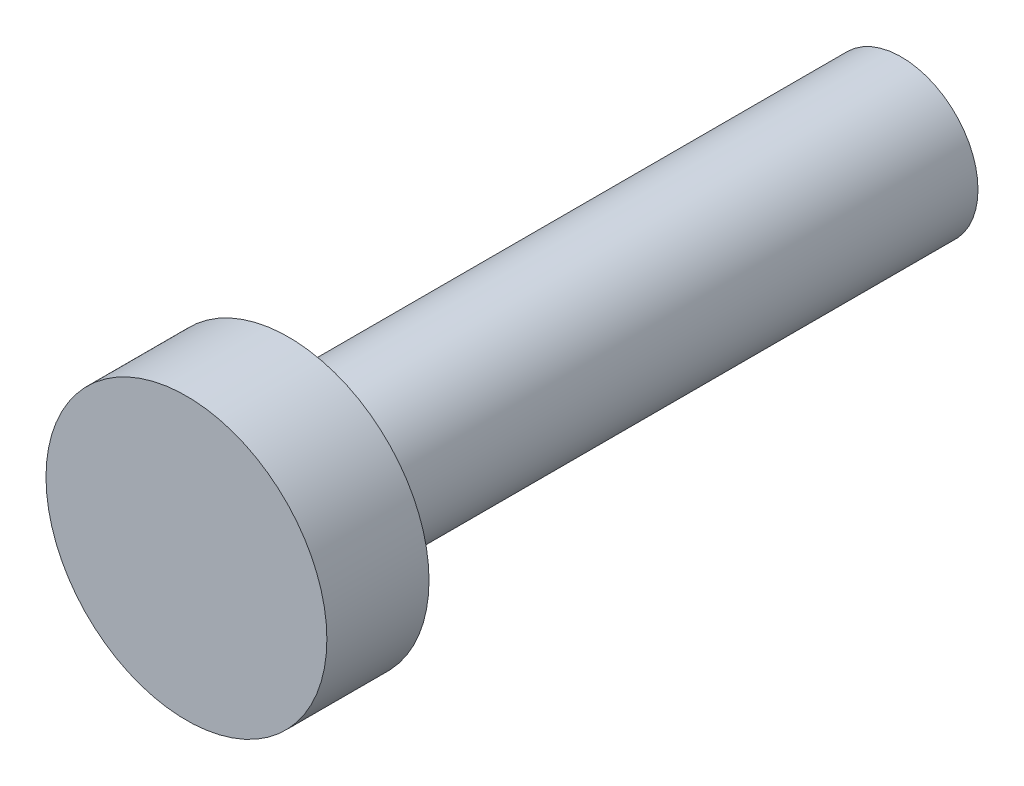
ISO-10303-21;
HEADER;
FILE_DESCRIPTION(('STEP AP214'),'2;1');
FILE_NAME('part.step','',(''),(''),'','','');
FILE_SCHEMA(('AUTOMOTIVE_DESIGN { 1 0 10303 214 1 1 1 1 }'));
ENDSEC;
DATA;
#1=APPLICATION_CONTEXT('core data for automotive mechanical design processes');
#2=APPLICATION_PROTOCOL_DEFINITION('international standard','automotive_design',2000,#1);
#3=PRODUCT_CONTEXT('',#1,'mechanical');
#4=PRODUCT('Part','Part','',(#3));
#5=PRODUCT_RELATED_PRODUCT_CATEGORY('part','',(#4));
#6=PRODUCT_DEFINITION_FORMATION('','',#4);
#7=PRODUCT_DEFINITION_CONTEXT('part definition',#1,'design');
#8=PRODUCT_DEFINITION('design','',#6,#7);
#9=PRODUCT_DEFINITION_SHAPE('','',#8);
#10=(LENGTH_UNIT() NAMED_UNIT(*) SI_UNIT(.MILLI.,.METRE.));
#11=(NAMED_UNIT(*) PLANE_ANGLE_UNIT() SI_UNIT($,.RADIAN.));
#12=(NAMED_UNIT(*) SI_UNIT($,.STERADIAN.) SOLID_ANGLE_UNIT());
#13=UNCERTAINTY_MEASURE_WITH_UNIT(LENGTH_MEASURE(1.E-05),#10,'distance_accuracy_value','');
#14=(GEOMETRIC_REPRESENTATION_CONTEXT(3) GLOBAL_UNCERTAINTY_ASSIGNED_CONTEXT((#13)) GLOBAL_UNIT_ASSIGNED_CONTEXT((#10,
#11,#12)) REPRESENTATION_CONTEXT('',''));
#15=CARTESIAN_POINT('',(0.,0.,0.));
#16=DIRECTION('',(0.,0.,1.));
#17=DIRECTION('',(1.,0.,0.));
#18=AXIS2_PLACEMENT_3D('',#15,#16,#17);
#19=CARTESIAN_POINT('',(0.,0.,0.));
#20=DIRECTION('',(0.,0.,-1.));
#21=DIRECTION('',(-1.,0.,0.));
#22=AXIS2_PLACEMENT_3D('',#19,#20,#21);
#23=CYLINDRICAL_SURFACE('',#22,1.5);
#24=CARTESIAN_POINT('',(0.,0.,0.));
#25=DIRECTION('',(0.,0.,1.));
#26=DIRECTION('',(1.,0.,0.));
#27=AXIS2_PLACEMENT_3D('',#24,#25,#26);
#28=CIRCLE('',#27,1.5);
#29=CARTESIAN_POINT('',(1.5,0.,0.));
#30=VERTEX_POINT('',#29);
#31=EDGE_CURVE('E10',#30,#30,#28,.T.);
#32=ORIENTED_EDGE('',*,*,#31,.F.);
#33=EDGE_LOOP('',(#32));
#34=FACE_BOUND('',#33,.T.);
#35=CARTESIAN_POINT('',(0.,0.,-12.));
#36=DIRECTION('',(0.,0.,1.));
#37=DIRECTION('',(1.,0.,0.));
#38=AXIS2_PLACEMENT_3D('',#35,#36,#37);
#39=CIRCLE('',#38,1.5);
#40=CARTESIAN_POINT('',(1.5,0.,-12.));
#41=VERTEX_POINT('',#40);
#42=EDGE_CURVE('E36',#41,#41,#39,.T.);
#43=ORIENTED_EDGE('',*,*,#42,.T.);
#44=EDGE_LOOP('',(#43));
#45=FACE_BOUND('',#44,.T.);
#46=ADVANCED_FACE('F33',(#34,#45),#23,.T.);
#47=CARTESIAN_POINT('',(0.,0.,-12.));
#48=DIRECTION('',(0.,0.,1.));
#49=DIRECTION('',(1.,0.,0.));
#50=AXIS2_PLACEMENT_3D('',#47,#48,#49);
#51=PLANE('',#50);
#52=ORIENTED_EDGE('',*,*,#42,.F.);
#53=EDGE_LOOP('',(#52));
#54=FACE_BOUND('',#53,.T.);
#55=ADVANCED_FACE('F56',(#54),#51,.F.);
#56=CARTESIAN_POINT('',(0.,0.,2.));
#57=DIRECTION('',(0.,0.,-1.));
#58=DIRECTION('',(-1.,0.,0.));
#59=AXIS2_PLACEMENT_3D('',#56,#57,#58);
#60=CYLINDRICAL_SURFACE('',#59,2.75);
#61=CARTESIAN_POINT('',(0.,0.,2.));
#62=DIRECTION('',(0.,0.,1.));
#63=DIRECTION('',(1.,0.,0.));
#64=AXIS2_PLACEMENT_3D('',#61,#62,#63);
#65=CIRCLE('',#64,2.75);
#66=CARTESIAN_POINT('',(2.75,0.,2.));
#67=VERTEX_POINT('',#66);
#68=EDGE_CURVE('E43',#67,#67,#65,.T.);
#69=ORIENTED_EDGE('',*,*,#68,.F.);
#70=EDGE_LOOP('',(#69));
#71=FACE_BOUND('',#70,.T.);
#72=CARTESIAN_POINT('',(0.,0.,0.));
#73=DIRECTION('',(0.,0.,1.));
#74=DIRECTION('',(1.,0.,0.));
#75=AXIS2_PLACEMENT_3D('',#72,#73,#74);
#76=CIRCLE('',#75,2.75);
#77=CARTESIAN_POINT('',(2.75,0.,0.));
#78=VERTEX_POINT('',#77);
#79=EDGE_CURVE('E45',#78,#78,#76,.T.);
#80=ORIENTED_EDGE('',*,*,#79,.T.);
#81=EDGE_LOOP('',(#80));
#82=FACE_BOUND('',#81,.T.);
#83=ADVANCED_FACE('F53',(#71,#82),#60,.T.);
#84=CARTESIAN_POINT('',(0.,0.,2.));
#85=DIRECTION('',(0.,0.,1.));
#86=DIRECTION('',(1.,0.,0.));
#87=AXIS2_PLACEMENT_3D('',#84,#85,#86);
#88=PLANE('',#87);
#89=ORIENTED_EDGE('',*,*,#68,.T.);
#90=EDGE_LOOP('',(#89));
#91=FACE_BOUND('',#90,.T.);
#92=ADVANCED_FACE('F51',(#91),#88,.T.);
#93=CARTESIAN_POINT('',(0.,0.,0.));
#94=DIRECTION('',(0.,0.,1.));
#95=DIRECTION('',(1.,0.,0.));
#96=AXIS2_PLACEMENT_3D('',#93,#94,#95);
#97=PLANE('',#96);
#98=ORIENTED_EDGE('',*,*,#31,.T.);
#99=EDGE_LOOP('',(#98));
#100=FACE_BOUND('',#99,.T.);
#101=ORIENTED_EDGE('',*,*,#79,.F.);
#102=EDGE_LOOP('',(#101));
#103=FACE_BOUND('',#102,.T.);
#104=ADVANCED_FACE('F60',(#100,#103),#97,.F.);
#105=CLOSED_SHELL('',(#46,#55,#83,#92,#104));
#106=MANIFOLD_SOLID_BREP('B2',#105);
#107=ADVANCED_BREP_SHAPE_REPRESENTATION('',(#18,#106),#14);
#108=SHAPE_DEFINITION_REPRESENTATION(#9,#107);
ENDSEC;
END-ISO-10303-21;
